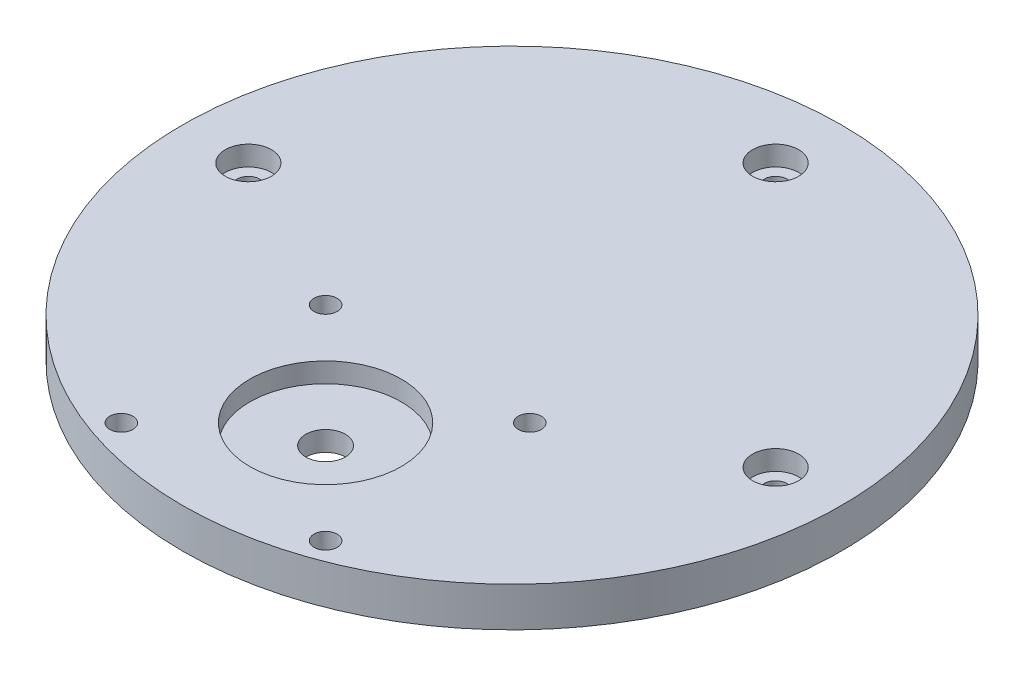
ISO-10303-21;
HEADER;
FILE_DESCRIPTION(('STEP AP214'),'2;1');
FILE_NAME('part.step','',(''),(''),'','','');
FILE_SCHEMA(('AUTOMOTIVE_DESIGN { 1 0 10303 214 1 1 1 1 }'));
ENDSEC;
DATA;
#1=APPLICATION_CONTEXT('core data for automotive mechanical design processes');
#2=APPLICATION_PROTOCOL_DEFINITION('international standard','automotive_design',2000,#1);
#3=PRODUCT_CONTEXT('',#1,'mechanical');
#4=PRODUCT('Part','Part','',(#3));
#5=PRODUCT_RELATED_PRODUCT_CATEGORY('part','',(#4));
#6=PRODUCT_DEFINITION_FORMATION('','',#4);
#7=PRODUCT_DEFINITION_CONTEXT('part definition',#1,'design');
#8=PRODUCT_DEFINITION('design','',#6,#7);
#9=PRODUCT_DEFINITION_SHAPE('','',#8);
#10=(LENGTH_UNIT() NAMED_UNIT(*) SI_UNIT(.MILLI.,.METRE.));
#11=(NAMED_UNIT(*) PLANE_ANGLE_UNIT() SI_UNIT($,.RADIAN.));
#12=(NAMED_UNIT(*) SI_UNIT($,.STERADIAN.) SOLID_ANGLE_UNIT());
#13=UNCERTAINTY_MEASURE_WITH_UNIT(LENGTH_MEASURE(1.E-05),#10,'distance_accuracy_value','');
#14=(GEOMETRIC_REPRESENTATION_CONTEXT(3) GLOBAL_UNCERTAINTY_ASSIGNED_CONTEXT((#13)) GLOBAL_UNIT_ASSIGNED_CONTEXT((#10,
#11,#12)) REPRESENTATION_CONTEXT('',''));
#15=CARTESIAN_POINT('',(0.,0.,0.));
#16=DIRECTION('',(0.,0.,1.));
#17=DIRECTION('',(1.,0.,0.));
#18=AXIS2_PLACEMENT_3D('',#15,#16,#17);
#19=CARTESIAN_POINT('',(-40.,-18.,0.));
#20=DIRECTION('',(0.,1.,0.));
#21=DIRECTION('',(0.,0.,1.));
#22=AXIS2_PLACEMENT_3D('',#19,#20,#21);
#23=CYLINDRICAL_SURFACE('',#22,1.75);
#24=CARTESIAN_POINT('',(-40.,0.,0.));
#25=DIRECTION('',(0.,1.,0.));
#26=DIRECTION('',(0.,0.,1.));
#27=AXIS2_PLACEMENT_3D('',#24,#25,#26);
#28=CIRCLE('',#27,1.75);
#29=CARTESIAN_POINT('',(-40.,0.,1.75));
#30=VERTEX_POINT('',#29);
#31=EDGE_CURVE('E58',#30,#30,#28,.T.);
#32=ORIENTED_EDGE('',*,*,#31,.F.);
#33=EDGE_LOOP('',(#32));
#34=FACE_BOUND('',#33,.T.);
#35=CARTESIAN_POINT('',(-40.,3.,0.));
#36=DIRECTION('',(0.,1.,0.));
#37=DIRECTION('',(0.,0.,1.));
#38=AXIS2_PLACEMENT_3D('',#35,#36,#37);
#39=CIRCLE('',#38,1.75);
#40=CARTESIAN_POINT('',(-40.,3.,1.75));
#41=VERTEX_POINT('',#40);
#42=EDGE_CURVE('E43',#41,#41,#39,.F.);
#43=ORIENTED_EDGE('',*,*,#42,.F.);
#44=EDGE_LOOP('',(#43));
#45=FACE_BOUND('',#44,.T.);
#46=ADVANCED_FACE('F39',(#34,#45),#23,.F.);
#47=CARTESIAN_POINT('',(40.,-18.,0.));
#48=DIRECTION('',(0.,1.,0.));
#49=DIRECTION('',(0.,0.,1.));
#50=AXIS2_PLACEMENT_3D('',#47,#48,#49);
#51=CYLINDRICAL_SURFACE('',#50,1.75);
#52=CARTESIAN_POINT('',(40.,0.,0.));
#53=DIRECTION('',(0.,1.,0.));
#54=DIRECTION('',(0.,0.,1.));
#55=AXIS2_PLACEMENT_3D('',#52,#53,#54);
#56=CIRCLE('',#55,1.75);
#57=CARTESIAN_POINT('',(40.,0.,1.75));
#58=VERTEX_POINT('',#57);
#59=EDGE_CURVE('E61',#58,#58,#56,.T.);
#60=ORIENTED_EDGE('',*,*,#59,.F.);
#61=EDGE_LOOP('',(#60));
#62=FACE_BOUND('',#61,.T.);
#63=CARTESIAN_POINT('',(40.,3.,0.));
#64=DIRECTION('',(0.,1.,0.));
#65=DIRECTION('',(0.,0.,1.));
#66=AXIS2_PLACEMENT_3D('',#63,#64,#65);
#67=CIRCLE('',#66,1.75);
#68=CARTESIAN_POINT('',(40.,3.,1.75));
#69=VERTEX_POINT('',#68);
#70=EDGE_CURVE('E86',#69,#69,#67,.F.);
#71=ORIENTED_EDGE('',*,*,#70,.F.);
#72=EDGE_LOOP('',(#71));
#73=FACE_BOUND('',#72,.T.);
#74=ADVANCED_FACE('F148',(#62,#73),#51,.F.);
#75=CARTESIAN_POINT('',(0.,-18.,-40.));
#76=DIRECTION('',(0.,1.,0.));
#77=DIRECTION('',(0.,0.,1.));
#78=AXIS2_PLACEMENT_3D('',#75,#76,#77);
#79=CYLINDRICAL_SURFACE('',#78,1.75);
#80=CARTESIAN_POINT('',(0.,0.,-40.));
#81=DIRECTION('',(0.,1.,0.));
#82=DIRECTION('',(0.,0.,1.));
#83=AXIS2_PLACEMENT_3D('',#80,#81,#82);
#84=CIRCLE('',#83,1.75);
#85=CARTESIAN_POINT('',(0.,0.,-38.25));
#86=VERTEX_POINT('',#85);
#87=EDGE_CURVE('E52',#86,#86,#84,.T.);
#88=ORIENTED_EDGE('',*,*,#87,.F.);
#89=EDGE_LOOP('',(#88));
#90=FACE_BOUND('',#89,.T.);
#91=CARTESIAN_POINT('',(0.,3.,-40.));
#92=DIRECTION('',(0.,1.,0.));
#93=DIRECTION('',(0.,0.,1.));
#94=AXIS2_PLACEMENT_3D('',#91,#92,#93);
#95=CIRCLE('',#94,1.75);
#96=CARTESIAN_POINT('',(0.,3.,-38.25));
#97=VERTEX_POINT('',#96);
#98=EDGE_CURVE('E84',#97,#97,#95,.F.);
#99=ORIENTED_EDGE('',*,*,#98,.F.);
#100=EDGE_LOOP('',(#99));
#101=FACE_BOUND('',#100,.T.);
#102=ADVANCED_FACE('F154',(#90,#101),#79,.F.);
#103=CARTESIAN_POINT('',(15.4939999999999,-31.,12.7902712474616));
#104=DIRECTION('',(0.,1.,0.));
#105=DIRECTION('',(0.,0.,1.));
#106=AXIS2_PLACEMENT_3D('',#103,#104,#105);
#107=CYLINDRICAL_SURFACE('',#106,1.75);
#108=CARTESIAN_POINT('',(15.4939999999999,6.,12.7902712474616));
#109=DIRECTION('',(0.,1.,0.));
#110=DIRECTION('',(0.,0.,1.));
#111=AXIS2_PLACEMENT_3D('',#108,#109,#110);
#112=CIRCLE('',#111,1.75);
#113=CARTESIAN_POINT('',(15.4939999999999,6.,14.5402712474616));
#114=VERTEX_POINT('',#113);
#115=EDGE_CURVE('E114',#114,#114,#112,.T.);
#116=ORIENTED_EDGE('',*,*,#115,.T.);
#117=EDGE_LOOP('',(#116));
#118=FACE_BOUND('',#117,.T.);
#119=CARTESIAN_POINT('',(15.4939999999999,3.,12.7902712474616));
#120=DIRECTION('',(0.,-1.,0.));
#121=DIRECTION('',(0.,0.,-1.));
#122=AXIS2_PLACEMENT_3D('',#119,#120,#121);
#123=CIRCLE('',#122,1.75);
#124=CARTESIAN_POINT('',(15.4939999999999,3.,11.0402712474616));
#125=VERTEX_POINT('',#124);
#126=EDGE_CURVE('E80',#125,#125,#123,.F.);
#127=ORIENTED_EDGE('',*,*,#126,.F.);
#128=EDGE_LOOP('',(#127));
#129=FACE_BOUND('',#128,.T.);
#130=ADVANCED_FACE('F161',(#118,#129),#107,.F.);
#131=CARTESIAN_POINT('',(15.4940000000004,-31.,43.7782712474616));
#132=DIRECTION('',(0.,1.,0.));
#133=DIRECTION('',(0.,0.,1.));
#134=AXIS2_PLACEMENT_3D('',#131,#132,#133);
#135=CYLINDRICAL_SURFACE('',#134,1.75);
#136=CARTESIAN_POINT('',(15.4940000000004,6.,43.7782712474616));
#137=DIRECTION('',(0.,1.,0.));
#138=DIRECTION('',(0.,0.,1.));
#139=AXIS2_PLACEMENT_3D('',#136,#137,#138);
#140=CIRCLE('',#139,1.75);
#141=CARTESIAN_POINT('',(15.4940000000004,6.,45.5282712474616));
#142=VERTEX_POINT('',#141);
#143=EDGE_CURVE('E111',#142,#142,#140,.T.);
#144=ORIENTED_EDGE('',*,*,#143,.T.);
#145=EDGE_LOOP('',(#144));
#146=FACE_BOUND('',#145,.T.);
#147=CARTESIAN_POINT('',(15.4940000000004,3.,43.7782712474616));
#148=DIRECTION('',(0.,-1.,0.));
#149=DIRECTION('',(0.,0.,-1.));
#150=AXIS2_PLACEMENT_3D('',#147,#148,#149);
#151=CIRCLE('',#150,1.75);
#152=CARTESIAN_POINT('',(15.4940000000004,3.,42.0282712474616));
#153=VERTEX_POINT('',#152);
#154=EDGE_CURVE('E77',#153,#153,#151,.F.);
#155=ORIENTED_EDGE('',*,*,#154,.F.);
#156=EDGE_LOOP('',(#155));
#157=FACE_BOUND('',#156,.T.);
#158=ADVANCED_FACE('F176',(#146,#157),#135,.F.);
#159=CARTESIAN_POINT('',(-15.4939999999996,-31.,43.7782712474619));
#160=DIRECTION('',(0.,1.,0.));
#161=DIRECTION('',(0.,0.,1.));
#162=AXIS2_PLACEMENT_3D('',#159,#160,#161);
#163=CYLINDRICAL_SURFACE('',#162,1.75);
#164=CARTESIAN_POINT('',(-15.4939999999996,6.,43.7782712474619));
#165=DIRECTION('',(0.,1.,0.));
#166=DIRECTION('',(0.,0.,1.));
#167=AXIS2_PLACEMENT_3D('',#164,#165,#166);
#168=CIRCLE('',#167,1.75);
#169=CARTESIAN_POINT('',(-15.4939999999996,6.,45.5282712474619));
#170=VERTEX_POINT('',#169);
#171=EDGE_CURVE('E115',#170,#170,#168,.T.);
#172=ORIENTED_EDGE('',*,*,#171,.T.);
#173=EDGE_LOOP('',(#172));
#174=FACE_BOUND('',#173,.T.);
#175=CARTESIAN_POINT('',(-15.4939999999996,3.,43.7782712474619));
#176=DIRECTION('',(0.,-1.,0.));
#177=DIRECTION('',(0.,0.,-1.));
#178=AXIS2_PLACEMENT_3D('',#175,#176,#177);
#179=CIRCLE('',#178,1.75);
#180=CARTESIAN_POINT('',(-15.4939999999996,3.,42.0282712474619));
#181=VERTEX_POINT('',#180);
#182=EDGE_CURVE('E73',#181,#181,#179,.F.);
#183=ORIENTED_EDGE('',*,*,#182,.F.);
#184=EDGE_LOOP('',(#183));
#185=FACE_BOUND('',#184,.T.);
#186=ADVANCED_FACE('F180',(#174,#185),#163,.F.);
#187=CARTESIAN_POINT('',(-15.4939999999998,-31.,12.790271247462));
#188=DIRECTION('',(0.,1.,0.));
#189=DIRECTION('',(0.,0.,1.));
#190=AXIS2_PLACEMENT_3D('',#187,#188,#189);
#191=CYLINDRICAL_SURFACE('',#190,1.75);
#192=CARTESIAN_POINT('',(-15.4939999999998,6.,12.790271247462));
#193=DIRECTION('',(0.,1.,0.));
#194=DIRECTION('',(0.,0.,1.));
#195=AXIS2_PLACEMENT_3D('',#192,#193,#194);
#196=CIRCLE('',#195,1.75);
#197=CARTESIAN_POINT('',(-15.4939999999998,6.,14.540271247462));
#198=VERTEX_POINT('',#197);
#199=EDGE_CURVE('E83',#198,#198,#196,.T.);
#200=ORIENTED_EDGE('',*,*,#199,.T.);
#201=EDGE_LOOP('',(#200));
#202=FACE_BOUND('',#201,.T.);
#203=CARTESIAN_POINT('',(-15.4939999999998,3.,12.790271247462));
#204=DIRECTION('',(0.,-1.,0.));
#205=DIRECTION('',(0.,0.,-1.));
#206=AXIS2_PLACEMENT_3D('',#203,#204,#205);
#207=CIRCLE('',#206,1.75);
#208=CARTESIAN_POINT('',(-15.4939999999998,3.,11.040271247462));
#209=VERTEX_POINT('',#208);
#210=EDGE_CURVE('E70',#209,#209,#207,.F.);
#211=ORIENTED_EDGE('',*,*,#210,.F.);
#212=EDGE_LOOP('',(#211));
#213=FACE_BOUND('',#212,.T.);
#214=ADVANCED_FACE('F165',(#202,#213),#191,.F.);
#215=CARTESIAN_POINT('',(0.,24.,28.2842712474616));
#216=DIRECTION('',(0.,-1.,0.));
#217=DIRECTION('',(0.,0.,-1.));
#218=AXIS2_PLACEMENT_3D('',#215,#216,#217);
#219=CYLINDRICAL_SURFACE('',#218,3.);
#220=CARTESIAN_POINT('',(0.,0.,28.2842712474616));
#221=DIRECTION('',(0.,-1.,0.));
#222=DIRECTION('',(0.,0.,-1.));
#223=AXIS2_PLACEMENT_3D('',#220,#221,#222);
#224=CIRCLE('',#223,3.);
#225=CARTESIAN_POINT('',(0.,0.,25.2842712474616));
#226=VERTEX_POINT('',#225);
#227=EDGE_CURVE('E55',#226,#226,#224,.T.);
#228=ORIENTED_EDGE('',*,*,#227,.T.);
#229=EDGE_LOOP('',(#228));
#230=FACE_BOUND('',#229,.T.);
#231=CARTESIAN_POINT('',(0.,3.,28.2842712474616));
#232=DIRECTION('',(0.,1.,0.));
#233=DIRECTION('',(0.,0.,1.));
#234=AXIS2_PLACEMENT_3D('',#231,#232,#233);
#235=CIRCLE('',#234,3.);
#236=CARTESIAN_POINT('',(0.,3.,31.2842712474616));
#237=VERTEX_POINT('',#236);
#238=EDGE_CURVE('E66',#237,#237,#235,.F.);
#239=ORIENTED_EDGE('',*,*,#238,.F.);
#240=EDGE_LOOP('',(#239));
#241=FACE_BOUND('',#240,.T.);
#242=ADVANCED_FACE('F142',(#230,#241),#219,.F.);
#243=CARTESIAN_POINT('',(0.,6.,0.));
#244=DIRECTION('',(0.,-1.,0.));
#245=DIRECTION('',(0.,0.,-1.));
#246=AXIS2_PLACEMENT_3D('',#243,#244,#245);
#247=CYLINDRICAL_SURFACE('',#246,50.);
#248=CARTESIAN_POINT('',(0.,6.,0.));
#249=DIRECTION('',(0.,1.,0.));
#250=DIRECTION('',(0.,0.,1.));
#251=AXIS2_PLACEMENT_3D('',#248,#249,#250);
#252=CIRCLE('',#251,50.);
#253=CARTESIAN_POINT('',(0.,6.,50.));
#254=VERTEX_POINT('',#253);
#255=EDGE_CURVE('E10',#254,#254,#252,.T.);
#256=ORIENTED_EDGE('',*,*,#255,.F.);
#257=EDGE_LOOP('',(#256));
#258=FACE_BOUND('',#257,.T.);
#259=CARTESIAN_POINT('',(0.,0.,0.));
#260=DIRECTION('',(0.,1.,0.));
#261=DIRECTION('',(0.,0.,1.));
#262=AXIS2_PLACEMENT_3D('',#259,#260,#261);
#263=CIRCLE('',#262,50.);
#264=CARTESIAN_POINT('',(0.,0.,50.));
#265=VERTEX_POINT('',#264);
#266=EDGE_CURVE('E47',#265,#265,#263,.T.);
#267=ORIENTED_EDGE('',*,*,#266,.T.);
#268=EDGE_LOOP('',(#267));
#269=FACE_BOUND('',#268,.T.);
#270=ADVANCED_FACE('F41',(#258,#269),#247,.T.);
#271=CARTESIAN_POINT('',(0.,6.,0.));
#272=DIRECTION('',(0.,1.,0.));
#273=DIRECTION('',(0.,0.,1.));
#274=AXIS2_PLACEMENT_3D('',#271,#272,#273);
#275=PLANE('',#274);
#276=CARTESIAN_POINT('',(0.,6.,-40.0000000000001));
#277=DIRECTION('',(0.,1.,0.));
#278=DIRECTION('',(0.,0.,1.));
#279=AXIS2_PLACEMENT_3D('',#276,#277,#278);
#280=CIRCLE('',#279,3.5);
#281=CARTESIAN_POINT('',(0.,6.,-36.5000000000001));
#282=VERTEX_POINT('',#281);
#283=EDGE_CURVE('E247',#282,#282,#280,.T.);
#284=ORIENTED_EDGE('',*,*,#283,.F.);
#285=EDGE_LOOP('',(#284));
#286=FACE_BOUND('',#285,.T.);
#287=CARTESIAN_POINT('',(-40.,6.,0.));
#288=DIRECTION('',(0.,1.,0.));
#289=DIRECTION('',(0.,0.,1.));
#290=AXIS2_PLACEMENT_3D('',#287,#288,#289);
#291=CIRCLE('',#290,3.5);
#292=CARTESIAN_POINT('',(-40.,6.,3.5));
#293=VERTEX_POINT('',#292);
#294=EDGE_CURVE('E250',#293,#293,#291,.T.);
#295=ORIENTED_EDGE('',*,*,#294,.F.);
#296=EDGE_LOOP('',(#295));
#297=FACE_BOUND('',#296,.T.);
#298=CARTESIAN_POINT('',(40.,6.,0.));
#299=DIRECTION('',(0.,1.,0.));
#300=DIRECTION('',(0.,0.,1.));
#301=AXIS2_PLACEMENT_3D('',#298,#299,#300);
#302=CIRCLE('',#301,3.5);
#303=CARTESIAN_POINT('',(40.,6.,3.5));
#304=VERTEX_POINT('',#303);
#305=EDGE_CURVE('E258',#304,#304,#302,.T.);
#306=ORIENTED_EDGE('',*,*,#305,.F.);
#307=EDGE_LOOP('',(#306));
#308=FACE_BOUND('',#307,.T.);
#309=ORIENTED_EDGE('',*,*,#199,.F.);
#310=EDGE_LOOP('',(#309));
#311=FACE_BOUND('',#310,.T.);
#312=ORIENTED_EDGE('',*,*,#171,.F.);
#313=EDGE_LOOP('',(#312));
#314=FACE_BOUND('',#313,.T.);
#315=ORIENTED_EDGE('',*,*,#143,.F.);
#316=EDGE_LOOP('',(#315));
#317=FACE_BOUND('',#316,.T.);
#318=ORIENTED_EDGE('',*,*,#115,.F.);
#319=EDGE_LOOP('',(#318));
#320=FACE_BOUND('',#319,.T.);
#321=CARTESIAN_POINT('',(0.,6.,28.2842712474616));
#322=DIRECTION('',(0.,1.,0.));
#323=DIRECTION('',(0.,0.,1.));
#324=AXIS2_PLACEMENT_3D('',#321,#322,#323);
#325=CIRCLE('',#324,11.5);
#326=CARTESIAN_POINT('',(0.,6.,39.7842712474616));
#327=VERTEX_POINT('',#326);
#328=EDGE_CURVE('E122',#327,#327,#325,.T.);
#329=ORIENTED_EDGE('',*,*,#328,.F.);
#330=EDGE_LOOP('',(#329));
#331=FACE_BOUND('',#330,.T.);
#332=ORIENTED_EDGE('',*,*,#255,.T.);
#333=EDGE_LOOP('',(#332));
#334=FACE_BOUND('',#333,.T.);
#335=ADVANCED_FACE('F129',(#286,#297,#308,#311,#314,#317,#320,#331,#334),#275,.T.);
#336=CARTESIAN_POINT('',(0.,0.,0.));
#337=DIRECTION('',(0.,1.,0.));
#338=DIRECTION('',(0.,0.,1.));
#339=AXIS2_PLACEMENT_3D('',#336,#337,#338);
#340=PLANE('',#339);
#341=CARTESIAN_POINT('',(-15.4939999999998,0.,43.7782712474617));
#342=DIRECTION('',(0.,-1.,0.));
#343=DIRECTION('',(0.,0.,-1.));
#344=AXIS2_PLACEMENT_3D('',#341,#342,#343);
#345=CIRCLE('',#344,3.);
#346=CARTESIAN_POINT('',(-15.4939999999998,0.,40.7782712474617));
#347=VERTEX_POINT('',#346);
#348=EDGE_CURVE('E96',#347,#347,#345,.T.);
#349=ORIENTED_EDGE('',*,*,#348,.F.);
#350=EDGE_LOOP('',(#349));
#351=FACE_BOUND('',#350,.T.);
#352=CARTESIAN_POINT('',(-15.494,0.,12.7902712474613));
#353=DIRECTION('',(0.,-1.,0.));
#354=DIRECTION('',(0.,0.,-1.));
#355=AXIS2_PLACEMENT_3D('',#352,#353,#354);
#356=CIRCLE('',#355,3.);
#357=CARTESIAN_POINT('',(-15.494,0.,9.79027124746131));
#358=VERTEX_POINT('',#357);
#359=EDGE_CURVE('E269',#358,#358,#356,.T.);
#360=ORIENTED_EDGE('',*,*,#359,.F.);
#361=EDGE_LOOP('',(#360));
#362=FACE_BOUND('',#361,.T.);
#363=CARTESIAN_POINT('',(15.4940000000004,0.,12.7902712474612));
#364=DIRECTION('',(0.,-1.,0.));
#365=DIRECTION('',(0.,0.,-1.));
#366=AXIS2_PLACEMENT_3D('',#363,#364,#365);
#367=CIRCLE('',#366,3.);
#368=CARTESIAN_POINT('',(15.4940000000004,0.,9.7902712474612));
#369=VERTEX_POINT('',#368);
#370=EDGE_CURVE('E110',#369,#369,#367,.T.);
#371=ORIENTED_EDGE('',*,*,#370,.F.);
#372=EDGE_LOOP('',(#371));
#373=FACE_BOUND('',#372,.T.);
#374=CARTESIAN_POINT('',(15.4940000000004,0.,43.7782712474616));
#375=DIRECTION('',(0.,-1.,0.));
#376=DIRECTION('',(0.,0.,-1.));
#377=AXIS2_PLACEMENT_3D('',#374,#375,#376);
#378=CIRCLE('',#377,3.);
#379=CARTESIAN_POINT('',(15.4940000000004,0.,40.7782712474616));
#380=VERTEX_POINT('',#379);
#381=EDGE_CURVE('E107',#380,#380,#378,.T.);
#382=ORIENTED_EDGE('',*,*,#381,.F.);
#383=EDGE_LOOP('',(#382));
#384=FACE_BOUND('',#383,.T.);
#385=ORIENTED_EDGE('',*,*,#227,.F.);
#386=EDGE_LOOP('',(#385));
#387=FACE_BOUND('',#386,.T.);
#388=ORIENTED_EDGE('',*,*,#87,.T.);
#389=EDGE_LOOP('',(#388));
#390=FACE_BOUND('',#389,.T.);
#391=ORIENTED_EDGE('',*,*,#59,.T.);
#392=EDGE_LOOP('',(#391));
#393=FACE_BOUND('',#392,.T.);
#394=ORIENTED_EDGE('',*,*,#31,.T.);
#395=EDGE_LOOP('',(#394));
#396=FACE_BOUND('',#395,.T.);
#397=ORIENTED_EDGE('',*,*,#266,.F.);
#398=EDGE_LOOP('',(#397));
#399=FACE_BOUND('',#398,.T.);
#400=ADVANCED_FACE('F131',(#351,#362,#373,#384,#387,#390,#393,#396,#399),#340,.F.);
#401=CARTESIAN_POINT('',(0.,3.,28.2842712474616));
#402=DIRECTION('',(0.,1.,0.));
#403=DIRECTION('',(0.,0.,1.));
#404=AXIS2_PLACEMENT_3D('',#401,#402,#403);
#405=PLANE('',#404);
#406=CARTESIAN_POINT('',(0.,3.,28.2842712474616));
#407=DIRECTION('',(0.,1.,0.));
#408=DIRECTION('',(0.,0.,1.));
#409=AXIS2_PLACEMENT_3D('',#406,#407,#408);
#410=CIRCLE('',#409,11.5);
#411=CARTESIAN_POINT('',(0.,3.,39.7842712474616));
#412=VERTEX_POINT('',#411);
#413=EDGE_CURVE('E69',#412,#412,#410,.T.);
#414=ORIENTED_EDGE('',*,*,#413,.T.);
#415=EDGE_LOOP('',(#414));
#416=FACE_BOUND('',#415,.T.);
#417=ORIENTED_EDGE('',*,*,#238,.T.);
#418=EDGE_LOOP('',(#417));
#419=FACE_BOUND('',#418,.T.);
#420=ADVANCED_FACE('F139',(#416,#419),#405,.T.);
#421=CARTESIAN_POINT('',(0.,3.,28.2842712474616));
#422=DIRECTION('',(0.,1.,0.));
#423=DIRECTION('',(0.,0.,1.));
#424=AXIS2_PLACEMENT_3D('',#421,#422,#423);
#425=CYLINDRICAL_SURFACE('',#424,11.5);
#426=ORIENTED_EDGE('',*,*,#413,.F.);
#427=EDGE_LOOP('',(#426));
#428=FACE_BOUND('',#427,.T.);
#429=ORIENTED_EDGE('',*,*,#328,.T.);
#430=EDGE_LOOP('',(#429));
#431=FACE_BOUND('',#430,.T.);
#432=ADVANCED_FACE('F127',(#428,#431),#425,.F.);
#433=CARTESIAN_POINT('',(-15.494,3.,12.7902712474613));
#434=DIRECTION('',(0.,-1.,0.));
#435=DIRECTION('',(0.,0.,-1.));
#436=AXIS2_PLACEMENT_3D('',#433,#434,#435);
#437=PLANE('',#436);
#438=CARTESIAN_POINT('',(-15.494,3.,12.7902712474613));
#439=DIRECTION('',(0.,-1.,0.));
#440=DIRECTION('',(0.,0.,-1.));
#441=AXIS2_PLACEMENT_3D('',#438,#439,#440);
#442=CIRCLE('',#441,3.);
#443=CARTESIAN_POINT('',(-15.494,3.,9.79027124746131));
#444=VERTEX_POINT('',#443);
#445=EDGE_CURVE('E101',#444,#444,#442,.T.);
#446=ORIENTED_EDGE('',*,*,#445,.T.);
#447=EDGE_LOOP('',(#446));
#448=FACE_BOUND('',#447,.T.);
#449=ORIENTED_EDGE('',*,*,#210,.T.);
#450=EDGE_LOOP('',(#449));
#451=FACE_BOUND('',#450,.T.);
#452=ADVANCED_FACE('F169',(#448,#451),#437,.T.);
#453=CARTESIAN_POINT('',(-15.494,3.,12.7902712474613));
#454=DIRECTION('',(0.,-1.,0.));
#455=DIRECTION('',(0.,0.,-1.));
#456=AXIS2_PLACEMENT_3D('',#453,#454,#455);
#457=CYLINDRICAL_SURFACE('',#456,3.);
#458=ORIENTED_EDGE('',*,*,#445,.F.);
#459=EDGE_LOOP('',(#458));
#460=FACE_BOUND('',#459,.T.);
#461=ORIENTED_EDGE('',*,*,#359,.T.);
#462=EDGE_LOOP('',(#461));
#463=FACE_BOUND('',#462,.T.);
#464=ADVANCED_FACE('F201',(#460,#463),#457,.F.);
#465=CARTESIAN_POINT('',(-15.4939999999998,3.,43.7782712474617));
#466=DIRECTION('',(0.,-1.,0.));
#467=DIRECTION('',(0.,0.,-1.));
#468=AXIS2_PLACEMENT_3D('',#465,#466,#467);
#469=PLANE('',#468);
#470=CARTESIAN_POINT('',(-15.4939999999998,3.,43.7782712474617));
#471=DIRECTION('',(0.,-1.,0.));
#472=DIRECTION('',(0.,0.,-1.));
#473=AXIS2_PLACEMENT_3D('',#470,#471,#472);
#474=CIRCLE('',#473,3.);
#475=CARTESIAN_POINT('',(-15.4939999999998,3.,40.7782712474617));
#476=VERTEX_POINT('',#475);
#477=EDGE_CURVE('E92',#476,#476,#474,.T.);
#478=ORIENTED_EDGE('',*,*,#477,.T.);
#479=EDGE_LOOP('',(#478));
#480=FACE_BOUND('',#479,.T.);
#481=ORIENTED_EDGE('',*,*,#182,.T.);
#482=EDGE_LOOP('',(#481));
#483=FACE_BOUND('',#482,.T.);
#484=ADVANCED_FACE('F198',(#480,#483),#469,.T.);
#485=CARTESIAN_POINT('',(-15.4939999999998,3.,43.7782712474617));
#486=DIRECTION('',(0.,-1.,0.));
#487=DIRECTION('',(0.,0.,-1.));
#488=AXIS2_PLACEMENT_3D('',#485,#486,#487);
#489=CYLINDRICAL_SURFACE('',#488,3.);
#490=ORIENTED_EDGE('',*,*,#477,.F.);
#491=EDGE_LOOP('',(#490));
#492=FACE_BOUND('',#491,.T.);
#493=ORIENTED_EDGE('',*,*,#348,.T.);
#494=EDGE_LOOP('',(#493));
#495=FACE_BOUND('',#494,.T.);
#496=ADVANCED_FACE('F196',(#492,#495),#489,.F.);
#497=CARTESIAN_POINT('',(15.4940000000004,3.,43.7782712474616));
#498=DIRECTION('',(0.,-1.,0.));
#499=DIRECTION('',(0.,0.,-1.));
#500=AXIS2_PLACEMENT_3D('',#497,#498,#499);
#501=PLANE('',#500);
#502=CARTESIAN_POINT('',(15.4940000000004,3.,43.7782712474616));
#503=DIRECTION('',(0.,-1.,0.));
#504=DIRECTION('',(0.,0.,-1.));
#505=AXIS2_PLACEMENT_3D('',#502,#503,#504);
#506=CIRCLE('',#505,3.);
#507=CARTESIAN_POINT('',(15.4940000000004,3.,40.7782712474616));
#508=VERTEX_POINT('',#507);
#509=EDGE_CURVE('E74',#508,#508,#506,.T.);
#510=ORIENTED_EDGE('',*,*,#509,.T.);
#511=EDGE_LOOP('',(#510));
#512=FACE_BOUND('',#511,.T.);
#513=ORIENTED_EDGE('',*,*,#154,.T.);
#514=EDGE_LOOP('',(#513));
#515=FACE_BOUND('',#514,.T.);
#516=ADVANCED_FACE('F192',(#512,#515),#501,.T.);
#517=CARTESIAN_POINT('',(15.4940000000004,3.,43.7782712474616));
#518=DIRECTION('',(0.,-1.,0.));
#519=DIRECTION('',(0.,0.,-1.));
#520=AXIS2_PLACEMENT_3D('',#517,#518,#519);
#521=CYLINDRICAL_SURFACE('',#520,3.);
#522=ORIENTED_EDGE('',*,*,#509,.F.);
#523=EDGE_LOOP('',(#522));
#524=FACE_BOUND('',#523,.T.);
#525=ORIENTED_EDGE('',*,*,#381,.T.);
#526=EDGE_LOOP('',(#525));
#527=FACE_BOUND('',#526,.T.);
#528=ADVANCED_FACE('F188',(#524,#527),#521,.F.);
#529=CARTESIAN_POINT('',(15.4940000000004,3.,12.7902712474612));
#530=DIRECTION('',(0.,-1.,0.));
#531=DIRECTION('',(0.,0.,-1.));
#532=AXIS2_PLACEMENT_3D('',#529,#530,#531);
#533=PLANE('',#532);
#534=CARTESIAN_POINT('',(15.4940000000004,3.,12.7902712474612));
#535=DIRECTION('',(0.,-1.,0.));
#536=DIRECTION('',(0.,0.,-1.));
#537=AXIS2_PLACEMENT_3D('',#534,#535,#536);
#538=CIRCLE('',#537,3.);
#539=CARTESIAN_POINT('',(15.4940000000004,3.,9.7902712474612));
#540=VERTEX_POINT('',#539);
#541=EDGE_CURVE('E266',#540,#540,#538,.T.);
#542=ORIENTED_EDGE('',*,*,#541,.T.);
#543=EDGE_LOOP('',(#542));
#544=FACE_BOUND('',#543,.T.);
#545=ORIENTED_EDGE('',*,*,#126,.T.);
#546=EDGE_LOOP('',(#545));
#547=FACE_BOUND('',#546,.T.);
#548=ADVANCED_FACE('F191',(#544,#547),#533,.T.);
#549=CARTESIAN_POINT('',(15.4940000000004,3.,12.7902712474612));
#550=DIRECTION('',(0.,-1.,0.));
#551=DIRECTION('',(0.,0.,-1.));
#552=AXIS2_PLACEMENT_3D('',#549,#550,#551);
#553=CYLINDRICAL_SURFACE('',#552,3.);
#554=ORIENTED_EDGE('',*,*,#541,.F.);
#555=EDGE_LOOP('',(#554));
#556=FACE_BOUND('',#555,.T.);
#557=ORIENTED_EDGE('',*,*,#370,.T.);
#558=EDGE_LOOP('',(#557));
#559=FACE_BOUND('',#558,.T.);
#560=ADVANCED_FACE('F213',(#556,#559),#553,.F.);
#561=CARTESIAN_POINT('',(0.,3.,-40.0000000000001));
#562=DIRECTION('',(0.,1.,0.));
#563=DIRECTION('',(0.,0.,1.));
#564=AXIS2_PLACEMENT_3D('',#561,#562,#563);
#565=PLANE('',#564);
#566=CARTESIAN_POINT('',(0.,3.,-40.0000000000001));
#567=DIRECTION('',(0.,1.,0.));
#568=DIRECTION('',(0.,0.,1.));
#569=AXIS2_PLACEMENT_3D('',#566,#567,#568);
#570=CIRCLE('',#569,3.5);
#571=CARTESIAN_POINT('',(0.,3.,-36.5000000000001));
#572=VERTEX_POINT('',#571);
#573=EDGE_CURVE('E87',#572,#572,#570,.T.);
#574=ORIENTED_EDGE('',*,*,#573,.T.);
#575=EDGE_LOOP('',(#574));
#576=FACE_BOUND('',#575,.T.);
#577=ORIENTED_EDGE('',*,*,#98,.T.);
#578=EDGE_LOOP('',(#577));
#579=FACE_BOUND('',#578,.T.);
#580=ADVANCED_FACE('F217',(#576,#579),#565,.T.);
#581=CARTESIAN_POINT('',(0.,3.,-40.0000000000001));
#582=DIRECTION('',(0.,1.,0.));
#583=DIRECTION('',(0.,0.,1.));
#584=AXIS2_PLACEMENT_3D('',#581,#582,#583);
#585=CYLINDRICAL_SURFACE('',#584,3.5);
#586=ORIENTED_EDGE('',*,*,#573,.F.);
#587=EDGE_LOOP('',(#586));
#588=FACE_BOUND('',#587,.T.);
#589=ORIENTED_EDGE('',*,*,#283,.T.);
#590=EDGE_LOOP('',(#589));
#591=FACE_BOUND('',#590,.T.);
#592=ADVANCED_FACE('F223',(#588,#591),#585,.F.);
#593=CARTESIAN_POINT('',(40.,3.,0.));
#594=DIRECTION('',(0.,1.,0.));
#595=DIRECTION('',(0.,0.,1.));
#596=AXIS2_PLACEMENT_3D('',#593,#594,#595);
#597=PLANE('',#596);
#598=CARTESIAN_POINT('',(40.,3.,0.));
#599=DIRECTION('',(0.,1.,0.));
#600=DIRECTION('',(0.,0.,1.));
#601=AXIS2_PLACEMENT_3D('',#598,#599,#600);
#602=CIRCLE('',#601,3.5);
#603=CARTESIAN_POINT('',(40.,3.,3.5));
#604=VERTEX_POINT('',#603);
#605=EDGE_CURVE('E261',#604,#604,#602,.T.);
#606=ORIENTED_EDGE('',*,*,#605,.T.);
#607=EDGE_LOOP('',(#606));
#608=FACE_BOUND('',#607,.T.);
#609=ORIENTED_EDGE('',*,*,#70,.T.);
#610=EDGE_LOOP('',(#609));
#611=FACE_BOUND('',#610,.T.);
#612=ADVANCED_FACE('F219',(#608,#611),#597,.T.);
#613=CARTESIAN_POINT('',(40.,3.,0.));
#614=DIRECTION('',(0.,1.,0.));
#615=DIRECTION('',(0.,0.,1.));
#616=AXIS2_PLACEMENT_3D('',#613,#614,#615);
#617=CYLINDRICAL_SURFACE('',#616,3.5);
#618=ORIENTED_EDGE('',*,*,#605,.F.);
#619=EDGE_LOOP('',(#618));
#620=FACE_BOUND('',#619,.T.);
#621=ORIENTED_EDGE('',*,*,#305,.T.);
#622=EDGE_LOOP('',(#621));
#623=FACE_BOUND('',#622,.T.);
#624=ADVANCED_FACE('F222',(#620,#623),#617,.F.);
#625=CARTESIAN_POINT('',(-40.,3.,0.));
#626=DIRECTION('',(0.,1.,0.));
#627=DIRECTION('',(0.,0.,1.));
#628=AXIS2_PLACEMENT_3D('',#625,#626,#627);
#629=PLANE('',#628);
#630=CARTESIAN_POINT('',(-40.,3.,0.));
#631=DIRECTION('',(0.,1.,0.));
#632=DIRECTION('',(0.,0.,1.));
#633=AXIS2_PLACEMENT_3D('',#630,#631,#632);
#634=CIRCLE('',#633,3.5);
#635=CARTESIAN_POINT('',(-40.,3.,3.5));
#636=VERTEX_POINT('',#635);
#637=EDGE_CURVE('E255',#636,#636,#634,.T.);
#638=ORIENTED_EDGE('',*,*,#637,.T.);
#639=EDGE_LOOP('',(#638));
#640=FACE_BOUND('',#639,.T.);
#641=ORIENTED_EDGE('',*,*,#42,.T.);
#642=EDGE_LOOP('',(#641));
#643=FACE_BOUND('',#642,.T.);
#644=ADVANCED_FACE('F227',(#640,#643),#629,.T.);
#645=CARTESIAN_POINT('',(-40.,3.,0.));
#646=DIRECTION('',(0.,1.,0.));
#647=DIRECTION('',(0.,0.,1.));
#648=AXIS2_PLACEMENT_3D('',#645,#646,#647);
#649=CYLINDRICAL_SURFACE('',#648,3.5);
#650=ORIENTED_EDGE('',*,*,#637,.F.);
#651=EDGE_LOOP('',(#650));
#652=FACE_BOUND('',#651,.T.);
#653=ORIENTED_EDGE('',*,*,#294,.T.);
#654=EDGE_LOOP('',(#653));
#655=FACE_BOUND('',#654,.T.);
#656=ADVANCED_FACE('F231',(#652,#655),#649,.F.);
#657=CLOSED_SHELL('',(#46,#74,#102,#130,#158,#186,#214,#242,#270,#335,#400,#420,#432,#452,#464,
#484,#496,#516,#528,#548,#560,#580,#592,#612,#624,#644,#656));
#658=MANIFOLD_SOLID_BREP('B2',#657);
#659=ADVANCED_BREP_SHAPE_REPRESENTATION('',(#18,#658),#14);
#660=SHAPE_DEFINITION_REPRESENTATION(#9,#659);
ENDSEC;
END-ISO-10303-21;
